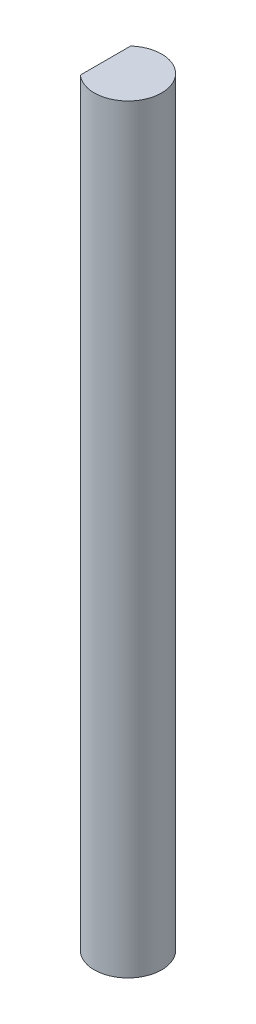
ISO-10303-21;
HEADER;
FILE_DESCRIPTION(('STEP AP214'),'2;1');
FILE_NAME('part.step','',(''),(''),'','','');
FILE_SCHEMA(('AUTOMOTIVE_DESIGN { 1 0 10303 214 1 1 1 1 }'));
ENDSEC;
DATA;
#1=APPLICATION_CONTEXT('core data for automotive mechanical design processes');
#2=APPLICATION_PROTOCOL_DEFINITION('international standard','automotive_design',2000,#1);
#3=PRODUCT_CONTEXT('',#1,'mechanical');
#4=PRODUCT('Part','Part','',(#3));
#5=PRODUCT_RELATED_PRODUCT_CATEGORY('part','',(#4));
#6=PRODUCT_DEFINITION_FORMATION('','',#4);
#7=PRODUCT_DEFINITION_CONTEXT('part definition',#1,'design');
#8=PRODUCT_DEFINITION('design','',#6,#7);
#9=PRODUCT_DEFINITION_SHAPE('','',#8);
#10=(LENGTH_UNIT() NAMED_UNIT(*) SI_UNIT(.MILLI.,.METRE.));
#11=(NAMED_UNIT(*) PLANE_ANGLE_UNIT() SI_UNIT($,.RADIAN.));
#12=(NAMED_UNIT(*) SI_UNIT($,.STERADIAN.) SOLID_ANGLE_UNIT());
#13=UNCERTAINTY_MEASURE_WITH_UNIT(LENGTH_MEASURE(1.E-05),#10,'distance_accuracy_value','');
#14=(GEOMETRIC_REPRESENTATION_CONTEXT(3) GLOBAL_UNCERTAINTY_ASSIGNED_CONTEXT((#13)) GLOBAL_UNIT_ASSIGNED_CONTEXT((#10,
#11,#12)) REPRESENTATION_CONTEXT('',''));
#15=CARTESIAN_POINT('',(0.,0.,0.));
#16=DIRECTION('',(0.,0.,1.));
#17=DIRECTION('',(1.,0.,0.));
#18=AXIS2_PLACEMENT_3D('',#15,#16,#17);
#19=CARTESIAN_POINT('',(-1.,33.8,0.));
#20=DIRECTION('',(1.,0.,0.));
#21=DIRECTION('',(0.,0.,-1.));
#22=AXIS2_PLACEMENT_3D('',#19,#20,#21);
#23=PLANE('',#22);
#24=DIRECTION('',(0.,0.,1.));
#25=VECTOR('',#24,1.);
#26=CARTESIAN_POINT('',(-1.,0.,0.));
#27=LINE('',#26,#25);
#28=CARTESIAN_POINT('',(-1.,0.,-1.1180339887499));
#29=VERTEX_POINT('',#28);
#30=CARTESIAN_POINT('',(-1.,0.,1.1180339887499));
#31=VERTEX_POINT('',#30);
#32=EDGE_CURVE('E72',#29,#31,#27,.T.);
#33=ORIENTED_EDGE('',*,*,#32,.T.);
#34=DIRECTION('',(0.,-1.,0.));
#35=VECTOR('',#34,1.);
#36=CARTESIAN_POINT('',(-1.,33.8,1.1180339887499));
#37=LINE('',#36,#35);
#38=CARTESIAN_POINT('',(-1.,33.8,1.1180339887499));
#39=VERTEX_POINT('',#38);
#40=EDGE_CURVE('E11',#39,#31,#37,.T.);
#41=ORIENTED_EDGE('',*,*,#40,.F.);
#42=DIRECTION('',(0.,0.,1.));
#43=VECTOR('',#42,1.);
#44=CARTESIAN_POINT('',(-1.,33.8,0.));
#45=LINE('',#44,#43);
#46=CARTESIAN_POINT('',(-1.,33.8,-1.1180339887499));
#47=VERTEX_POINT('',#46);
#48=EDGE_CURVE('E71',#47,#39,#45,.T.);
#49=ORIENTED_EDGE('',*,*,#48,.F.);
#50=DIRECTION('',(0.,-1.,0.));
#51=VECTOR('',#50,1.);
#52=CARTESIAN_POINT('',(-1.,33.8,-1.1180339887499));
#53=LINE('',#52,#51);
#54=EDGE_CURVE('E49',#47,#29,#53,.T.);
#55=ORIENTED_EDGE('',*,*,#54,.T.);
#56=EDGE_LOOP('',(#33,#41,#49,#55));
#57=FACE_BOUND('',#56,.T.);
#58=ADVANCED_FACE('F41',(#57),#23,.F.);
#59=CARTESIAN_POINT('',(0.,33.8,0.));
#60=DIRECTION('',(0.,-1.,0.));
#61=DIRECTION('',(0.,0.,-1.));
#62=AXIS2_PLACEMENT_3D('',#59,#60,#61);
#63=CYLINDRICAL_SURFACE('',#62,1.5);
#64=CARTESIAN_POINT('',(0.,0.,0.));
#65=DIRECTION('',(0.,1.,0.));
#66=DIRECTION('',(0.,0.,1.));
#67=AXIS2_PLACEMENT_3D('',#64,#65,#66);
#68=CIRCLE('',#67,1.5);
#69=EDGE_CURVE('E64',#31,#29,#68,.T.);
#70=ORIENTED_EDGE('',*,*,#69,.T.);
#71=ORIENTED_EDGE('',*,*,#54,.F.);
#72=CARTESIAN_POINT('',(0.,33.8,0.));
#73=DIRECTION('',(0.,1.,0.));
#74=DIRECTION('',(0.,0.,1.));
#75=AXIS2_PLACEMENT_3D('',#72,#73,#74);
#76=CIRCLE('',#75,1.5);
#77=EDGE_CURVE('E56',#39,#47,#76,.T.);
#78=ORIENTED_EDGE('',*,*,#77,.F.);
#79=ORIENTED_EDGE('',*,*,#40,.T.);
#80=EDGE_LOOP('',(#70,#71,#78,#79));
#81=FACE_BOUND('',#80,.T.);
#82=ADVANCED_FACE('F67',(#81),#63,.T.);
#83=CARTESIAN_POINT('',(0.,33.8,0.));
#84=DIRECTION('',(0.,1.,0.));
#85=DIRECTION('',(0.,0.,1.));
#86=AXIS2_PLACEMENT_3D('',#83,#84,#85);
#87=PLANE('',#86);
#88=ORIENTED_EDGE('',*,*,#48,.T.);
#89=ORIENTED_EDGE('',*,*,#77,.T.);
#90=EDGE_LOOP('',(#88,#89));
#91=FACE_BOUND('',#90,.T.);
#92=ADVANCED_FACE('F79',(#91),#87,.T.);
#93=CARTESIAN_POINT('',(0.,0.,0.));
#94=DIRECTION('',(0.,1.,0.));
#95=DIRECTION('',(0.,0.,1.));
#96=AXIS2_PLACEMENT_3D('',#93,#94,#95);
#97=PLANE('',#96);
#98=ORIENTED_EDGE('',*,*,#32,.F.);
#99=ORIENTED_EDGE('',*,*,#69,.F.);
#100=EDGE_LOOP('',(#98,#99));
#101=FACE_BOUND('',#100,.T.);
#102=ADVANCED_FACE('F75',(#101),#97,.F.);
#103=CLOSED_SHELL('',(#58,#82,#92,#102));
#104=MANIFOLD_SOLID_BREP('B2',#103);
#105=ADVANCED_BREP_SHAPE_REPRESENTATION('',(#18,#104),#14);
#106=SHAPE_DEFINITION_REPRESENTATION(#9,#105);
ENDSEC;
END-ISO-10303-21;
